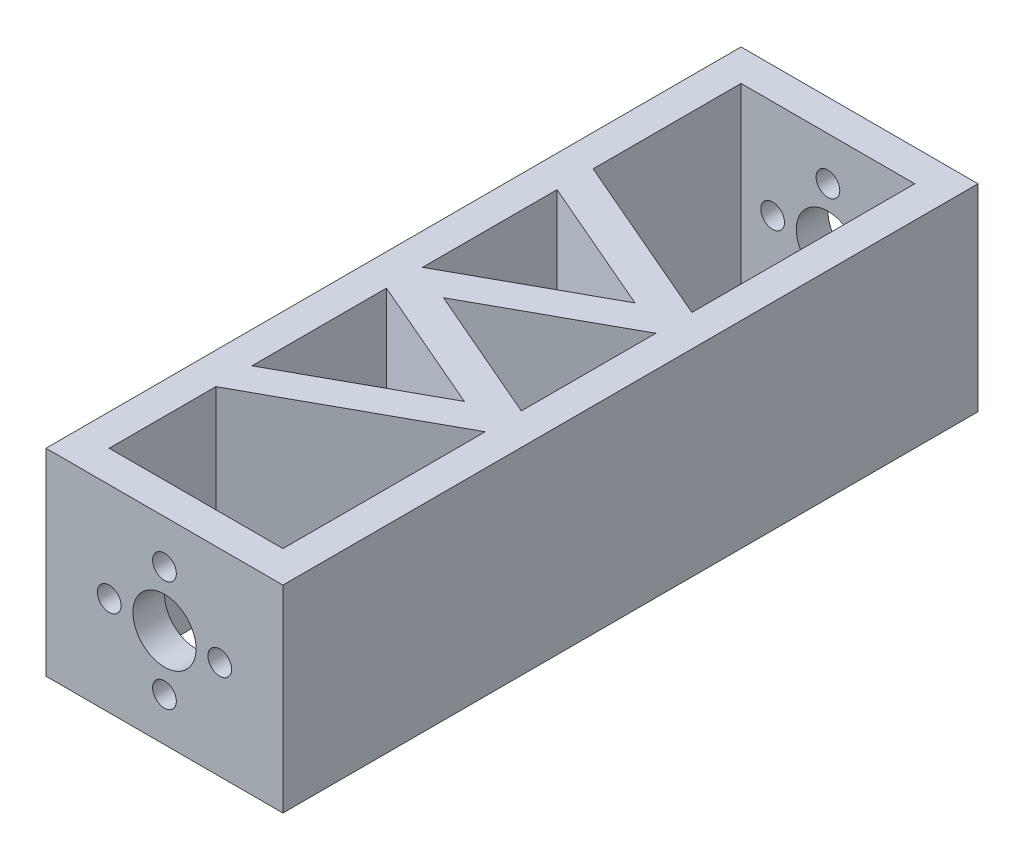
ISO-10303-21;
HEADER;
FILE_DESCRIPTION(('STEP AP214'),'2;1');
FILE_NAME('part.step','',(''),(''),'','','');
FILE_SCHEMA(('AUTOMOTIVE_DESIGN { 1 0 10303 214 1 1 1 1 }'));
ENDSEC;
DATA;
#1=APPLICATION_CONTEXT('core data for automotive mechanical design processes');
#2=APPLICATION_PROTOCOL_DEFINITION('international standard','automotive_design',2000,#1);
#3=PRODUCT_CONTEXT('',#1,'mechanical');
#4=PRODUCT('Part','Part','',(#3));
#5=PRODUCT_RELATED_PRODUCT_CATEGORY('part','',(#4));
#6=PRODUCT_DEFINITION_FORMATION('','',#4);
#7=PRODUCT_DEFINITION_CONTEXT('part definition',#1,'design');
#8=PRODUCT_DEFINITION('design','',#6,#7);
#9=PRODUCT_DEFINITION_SHAPE('','',#8);
#10=(LENGTH_UNIT() NAMED_UNIT(*) SI_UNIT(.MILLI.,.METRE.));
#11=(NAMED_UNIT(*) PLANE_ANGLE_UNIT() SI_UNIT($,.RADIAN.));
#12=(NAMED_UNIT(*) SI_UNIT($,.STERADIAN.) SOLID_ANGLE_UNIT());
#13=UNCERTAINTY_MEASURE_WITH_UNIT(LENGTH_MEASURE(1.E-05),#10,'distance_accuracy_value','');
#14=(GEOMETRIC_REPRESENTATION_CONTEXT(3) GLOBAL_UNCERTAINTY_ASSIGNED_CONTEXT((#13)) GLOBAL_UNIT_ASSIGNED_CONTEXT((#10,
#11,#12)) REPRESENTATION_CONTEXT('',''));
#15=CARTESIAN_POINT('',(0.,0.,0.));
#16=DIRECTION('',(0.,0.,1.));
#17=DIRECTION('',(1.,0.,0.));
#18=AXIS2_PLACEMENT_3D('',#15,#16,#17);
#19=CARTESIAN_POINT('',(-11.,12.5,84.));
#20=DIRECTION('',(-1.,0.,0.));
#21=DIRECTION('',(0.,-1.,0.));
#22=AXIS2_PLACEMENT_3D('',#19,#20,#21);
#23=PLANE('',#22);
#24=DIRECTION('',(0.,-1.,0.));
#25=VECTOR('',#24,1.);
#26=CARTESIAN_POINT('',(-11.,12.5,65.9276597354407));
#27=LINE('',#26,#25);
#28=CARTESIAN_POINT('',(-11.,12.5,65.9276597354407));
#29=VERTEX_POINT('',#28);
#30=CARTESIAN_POINT('',(-11.,-12.5,65.9276597354407));
#31=VERTEX_POINT('',#30);
#32=EDGE_CURVE('E199',#29,#31,#27,.T.);
#33=ORIENTED_EDGE('',*,*,#32,.T.);
#34=DIRECTION('',(0.,0.,-1.));
#35=VECTOR('',#34,1.);
#36=CARTESIAN_POINT('',(-11.,-12.5,84.));
#37=LINE('',#36,#35);
#38=CARTESIAN_POINT('',(-11.,-12.5,48.8944644043383));
#39=VERTEX_POINT('',#38);
#40=EDGE_CURVE('E62',#31,#39,#37,.T.);
#41=ORIENTED_EDGE('',*,*,#40,.T.);
#42=DIRECTION('',(0.,-1.,0.));
#43=VECTOR('',#42,1.);
#44=CARTESIAN_POINT('',(-11.,12.5,48.8944644043383));
#45=LINE('',#44,#43);
#46=CARTESIAN_POINT('',(-11.,12.5,48.8944644043383));
#47=VERTEX_POINT('',#46);
#48=EDGE_CURVE('E192',#47,#39,#45,.T.);
#49=ORIENTED_EDGE('',*,*,#48,.F.);
#50=DIRECTION('',(0.,0.,-1.));
#51=VECTOR('',#50,1.);
#52=CARTESIAN_POINT('',(-11.,12.5,84.));
#53=LINE('',#52,#51);
#54=EDGE_CURVE('E206',#29,#47,#53,.T.);
#55=ORIENTED_EDGE('',*,*,#54,.F.);
#56=EDGE_LOOP('',(#33,#41,#49,#55));
#57=FACE_BOUND('',#56,.T.);
#58=ADVANCED_FACE('F39',(#57),#23,.F.);
#59=DIRECTION('',(0.,-1.,0.));
#60=VECTOR('',#59,1.);
#61=CARTESIAN_POINT('',(-11.,12.5,70.4934339027886));
#62=LINE('',#61,#60);
#63=CARTESIAN_POINT('',(-11.,12.5,70.4934339027886));
#64=VERTEX_POINT('',#63);
#65=CARTESIAN_POINT('',(-11.,-12.5,70.4934339027886));
#66=VERTEX_POINT('',#65);
#67=EDGE_CURVE('E242',#64,#66,#62,.T.);
#68=ORIENTED_EDGE('',*,*,#67,.F.);
#69=CARTESIAN_POINT('',(-11.,12.5,84.));
#70=VERTEX_POINT('',#69);
#71=EDGE_CURVE('E340',#70,#64,#53,.T.);
#72=ORIENTED_EDGE('',*,*,#71,.F.);
#73=DIRECTION('',(0.,1.,0.));
#74=VECTOR('',#73,1.);
#75=CARTESIAN_POINT('',(-11.,12.5,84.));
#76=LINE('',#75,#74);
#77=CARTESIAN_POINT('',(-11.,-12.5,84.));
#78=VERTEX_POINT('',#77);
#79=EDGE_CURVE('E334',#78,#70,#76,.T.);
#80=ORIENTED_EDGE('',*,*,#79,.F.);
#81=EDGE_CURVE('E344',#78,#66,#37,.T.);
#82=ORIENTED_EDGE('',*,*,#81,.T.);
#83=EDGE_LOOP('',(#68,#72,#80,#82));
#84=FACE_BOUND('',#83,.T.);
#85=ADVANCED_FACE('F450',(#84),#23,.F.);
#86=DIRECTION('',(0.,-1.,0.));
#87=VECTOR('',#86,1.);
#88=CARTESIAN_POINT('',(-11.,12.5,22.7297207385401));
#89=LINE('',#88,#87);
#90=CARTESIAN_POINT('',(-11.,12.5,22.7297207385401));
#91=VERTEX_POINT('',#90);
#92=CARTESIAN_POINT('',(-11.,-12.5,22.7297207385401));
#93=VERTEX_POINT('',#92);
#94=EDGE_CURVE('E260',#91,#93,#89,.T.);
#95=ORIENTED_EDGE('',*,*,#94,.T.);
#96=CARTESIAN_POINT('',(-11.,-12.5,4.));
#97=VERTEX_POINT('',#96);
#98=EDGE_CURVE('E343',#93,#97,#37,.T.);
#99=ORIENTED_EDGE('',*,*,#98,.T.);
#100=DIRECTION('',(0.,1.,0.));
#101=VECTOR('',#100,1.);
#102=CARTESIAN_POINT('',(-11.,12.5,4.));
#103=LINE('',#102,#101);
#104=CARTESIAN_POINT('',(-11.,12.5,4.));
#105=VERTEX_POINT('',#104);
#106=EDGE_CURVE('E331',#97,#105,#103,.T.);
#107=ORIENTED_EDGE('',*,*,#106,.T.);
#108=EDGE_CURVE('E337',#91,#105,#53,.T.);
#109=ORIENTED_EDGE('',*,*,#108,.F.);
#110=EDGE_LOOP('',(#95,#99,#107,#109));
#111=FACE_BOUND('',#110,.T.);
#112=ADVANCED_FACE('F425',(#111),#23,.F.);
#113=CARTESIAN_POINT('',(-11.,-12.5,44.3286902369904));
#114=VERTEX_POINT('',#113);
#115=CARTESIAN_POINT('',(-11.,-12.5,27.295494905888));
#116=VERTEX_POINT('',#115);
#117=EDGE_CURVE('E54',#114,#116,#37,.T.);
#118=ORIENTED_EDGE('',*,*,#117,.T.);
#119=DIRECTION('',(0.,-1.,0.));
#120=VECTOR('',#119,1.);
#121=CARTESIAN_POINT('',(-11.,12.5,27.295494905888));
#122=LINE('',#121,#120);
#123=CARTESIAN_POINT('',(-11.,12.5,27.295494905888));
#124=VERTEX_POINT('',#123);
#125=EDGE_CURVE('E263',#124,#116,#122,.T.);
#126=ORIENTED_EDGE('',*,*,#125,.F.);
#127=CARTESIAN_POINT('',(-11.,12.5,44.3286902369904));
#128=VERTEX_POINT('',#127);
#129=EDGE_CURVE('E427',#128,#124,#53,.T.);
#130=ORIENTED_EDGE('',*,*,#129,.F.);
#131=DIRECTION('',(0.,-1.,0.));
#132=VECTOR('',#131,1.);
#133=CARTESIAN_POINT('',(-11.,12.5,44.3286902369904));
#134=LINE('',#133,#132);
#135=EDGE_CURVE('E267',#128,#114,#134,.T.);
#136=ORIENTED_EDGE('',*,*,#135,.T.);
#137=EDGE_LOOP('',(#118,#126,#130,#136));
#138=FACE_BOUND('',#137,.T.);
#139=ADVANCED_FACE('F438',(#138),#23,.F.);
#140=CARTESIAN_POINT('',(11.,12.5,84.));
#141=DIRECTION('',(1.,0.,0.));
#142=DIRECTION('',(0.,1.,0.));
#143=AXIS2_PLACEMENT_3D('',#140,#141,#142);
#144=PLANE('',#143);
#145=DIRECTION('',(0.,-1.,0.));
#146=VECTOR('',#145,1.);
#147=CARTESIAN_POINT('',(11.,12.5,58.3855692746451));
#148=LINE('',#147,#146);
#149=CARTESIAN_POINT('',(11.,12.5,58.3855692746451));
#150=VERTEX_POINT('',#149);
#151=CARTESIAN_POINT('',(11.,-12.5,58.3855692746451));
#152=VERTEX_POINT('',#151);
#153=EDGE_CURVE('E245',#150,#152,#148,.T.);
#154=ORIENTED_EDGE('',*,*,#153,.T.);
#155=DIRECTION('',(0.,0.,-1.));
#156=VECTOR('',#155,1.);
#157=CARTESIAN_POINT('',(11.,-12.5,84.));
#158=LINE('',#157,#156);
#159=CARTESIAN_POINT('',(11.,-12.5,84.));
#160=VERTEX_POINT('',#159);
#161=EDGE_CURVE('E323',#160,#152,#158,.T.);
#162=ORIENTED_EDGE('',*,*,#161,.F.);
#163=DIRECTION('',(0.,-1.,0.));
#164=VECTOR('',#163,1.);
#165=CARTESIAN_POINT('',(11.,12.5,84.));
#166=LINE('',#165,#164);
#167=CARTESIAN_POINT('',(11.,12.5,84.));
#168=VERTEX_POINT('',#167);
#169=EDGE_CURVE('E326',#168,#160,#166,.T.);
#170=ORIENTED_EDGE('',*,*,#169,.F.);
#171=DIRECTION('',(0.,0.,-1.));
#172=VECTOR('',#171,1.);
#173=CARTESIAN_POINT('',(11.,12.5,84.));
#174=LINE('',#173,#172);
#175=EDGE_CURVE('E318',#168,#150,#174,.T.);
#176=ORIENTED_EDGE('',*,*,#175,.T.);
#177=EDGE_LOOP('',(#154,#162,#170,#176));
#178=FACE_BOUND('',#177,.T.);
#179=ADVANCED_FACE('F440',(#178),#144,.F.);
#180=DIRECTION('',(0.,-1.,0.));
#181=VECTOR('',#180,1.);
#182=CARTESIAN_POINT('',(11.,12.5,53.8197951072972));
#183=LINE('',#182,#181);
#184=CARTESIAN_POINT('',(11.,12.5,53.8197951072972));
#185=VERTEX_POINT('',#184);
#186=CARTESIAN_POINT('',(11.,-12.5,53.8197951072972));
#187=VERTEX_POINT('',#186);
#188=EDGE_CURVE('E248',#185,#187,#183,.T.);
#189=ORIENTED_EDGE('',*,*,#188,.F.);
#190=CARTESIAN_POINT('',(11.,12.5,36.7865997761949));
#191=VERTEX_POINT('',#190);
#192=EDGE_CURVE('E322',#185,#191,#174,.T.);
#193=ORIENTED_EDGE('',*,*,#192,.T.);
#194=DIRECTION('',(0.,-1.,0.));
#195=VECTOR('',#194,1.);
#196=CARTESIAN_POINT('',(11.,12.5,36.7865997761949));
#197=LINE('',#196,#195);
#198=CARTESIAN_POINT('',(11.,-12.5,36.7865997761949));
#199=VERTEX_POINT('',#198);
#200=EDGE_CURVE('E254',#191,#199,#197,.T.);
#201=ORIENTED_EDGE('',*,*,#200,.T.);
#202=EDGE_CURVE('E327',#187,#199,#158,.T.);
#203=ORIENTED_EDGE('',*,*,#202,.F.);
#204=EDGE_LOOP('',(#189,#193,#201,#203));
#205=FACE_BOUND('',#204,.T.);
#206=ADVANCED_FACE('F446',(#205),#144,.F.);
#207=DIRECTION('',(0.,-1.,0.));
#208=VECTOR('',#207,1.);
#209=CARTESIAN_POINT('',(11.,12.5,32.220825608847));
#210=LINE('',#209,#208);
#211=CARTESIAN_POINT('',(11.,12.5,32.220825608847));
#212=VERTEX_POINT('',#211);
#213=CARTESIAN_POINT('',(11.,-12.5,32.220825608847));
#214=VERTEX_POINT('',#213);
#215=EDGE_CURVE('E257',#212,#214,#210,.T.);
#216=ORIENTED_EDGE('',*,*,#215,.F.);
#217=CARTESIAN_POINT('',(11.,12.5,4.));
#218=VERTEX_POINT('',#217);
#219=EDGE_CURVE('E313',#212,#218,#174,.T.);
#220=ORIENTED_EDGE('',*,*,#219,.T.);
#221=DIRECTION('',(0.,-1.,0.));
#222=VECTOR('',#221,1.);
#223=CARTESIAN_POINT('',(11.,12.5,4.));
#224=LINE('',#223,#222);
#225=CARTESIAN_POINT('',(11.,-12.5,4.));
#226=VERTEX_POINT('',#225);
#227=EDGE_CURVE('E328',#218,#226,#224,.T.);
#228=ORIENTED_EDGE('',*,*,#227,.T.);
#229=EDGE_CURVE('E321',#214,#226,#158,.T.);
#230=ORIENTED_EDGE('',*,*,#229,.F.);
#231=EDGE_LOOP('',(#216,#220,#228,#230));
#232=FACE_BOUND('',#231,.T.);
#233=ADVANCED_FACE('F449',(#232),#144,.F.);
#234=CARTESIAN_POINT('',(0.,0.,4.));
#235=DIRECTION('',(0.,0.,-1.));
#236=DIRECTION('',(-1.,0.,0.));
#237=AXIS2_PLACEMENT_3D('',#234,#235,#236);
#238=PLANE('',#237);
#239=CARTESIAN_POINT('',(7.,0.,4.));
#240=DIRECTION('',(0.,0.,1.));
#241=DIRECTION('',(1.,0.,0.));
#242=AXIS2_PLACEMENT_3D('',#239,#240,#241);
#243=CIRCLE('',#242,1.5);
#244=CARTESIAN_POINT('',(8.5,0.,4.));
#245=VERTEX_POINT('',#244);
#246=EDGE_CURVE('E371',#245,#245,#243,.T.);
#247=ORIENTED_EDGE('',*,*,#246,.F.);
#248=EDGE_LOOP('',(#247));
#249=FACE_BOUND('',#248,.T.);
#250=CARTESIAN_POINT('',(0.,7.,4.));
#251=DIRECTION('',(0.,0.,1.));
#252=DIRECTION('',(1.,0.,0.));
#253=AXIS2_PLACEMENT_3D('',#250,#251,#252);
#254=CIRCLE('',#253,1.5);
#255=CARTESIAN_POINT('',(1.5,7.,4.));
#256=VERTEX_POINT('',#255);
#257=EDGE_CURVE('E365',#256,#256,#254,.T.);
#258=ORIENTED_EDGE('',*,*,#257,.F.);
#259=EDGE_LOOP('',(#258));
#260=FACE_BOUND('',#259,.T.);
#261=CARTESIAN_POINT('',(-7.,0.,4.));
#262=DIRECTION('',(0.,0.,1.));
#263=DIRECTION('',(1.,0.,0.));
#264=AXIS2_PLACEMENT_3D('',#261,#262,#263);
#265=CIRCLE('',#264,1.5);
#266=CARTESIAN_POINT('',(-5.5,0.,4.));
#267=VERTEX_POINT('',#266);
#268=EDGE_CURVE('E359',#267,#267,#265,.T.);
#269=ORIENTED_EDGE('',*,*,#268,.F.);
#270=EDGE_LOOP('',(#269));
#271=FACE_BOUND('',#270,.T.);
#272=CARTESIAN_POINT('',(0.,-7.,4.));
#273=DIRECTION('',(0.,0.,1.));
#274=DIRECTION('',(1.,0.,0.));
#275=AXIS2_PLACEMENT_3D('',#272,#273,#274);
#276=CIRCLE('',#275,1.5);
#277=CARTESIAN_POINT('',(1.5,-7.,4.));
#278=VERTEX_POINT('',#277);
#279=EDGE_CURVE('E353',#278,#278,#276,.T.);
#280=ORIENTED_EDGE('',*,*,#279,.F.);
#281=EDGE_LOOP('',(#280));
#282=FACE_BOUND('',#281,.T.);
#283=CARTESIAN_POINT('',(0.,0.,4.));
#284=DIRECTION('',(0.,0.,1.));
#285=DIRECTION('',(1.,0.,0.));
#286=AXIS2_PLACEMENT_3D('',#283,#284,#285);
#287=CIRCLE('',#286,4.);
#288=CARTESIAN_POINT('',(4.,0.,4.));
#289=VERTEX_POINT('',#288);
#290=EDGE_CURVE('E347',#289,#289,#287,.T.);
#291=ORIENTED_EDGE('',*,*,#290,.F.);
#292=EDGE_LOOP('',(#291));
#293=FACE_BOUND('',#292,.T.);
#294=ORIENTED_EDGE('',*,*,#227,.F.);
#295=DIRECTION('',(-1.,0.,0.));
#296=VECTOR('',#295,1.);
#297=CARTESIAN_POINT('',(-15.,12.5,4.));
#298=LINE('',#297,#296);
#299=EDGE_CURVE('E377',#218,#105,#298,.T.);
#300=ORIENTED_EDGE('',*,*,#299,.T.);
#301=ORIENTED_EDGE('',*,*,#106,.F.);
#302=DIRECTION('',(1.,0.,0.));
#303=VECTOR('',#302,1.);
#304=CARTESIAN_POINT('',(-15.,-12.5,4.));
#305=LINE('',#304,#303);
#306=EDGE_CURVE('E380',#97,#226,#305,.T.);
#307=ORIENTED_EDGE('',*,*,#306,.T.);
#308=EDGE_LOOP('',(#294,#300,#301,#307));
#309=FACE_BOUND('',#308,.T.);
#310=ADVANCED_FACE('F472',(#249,#260,#271,#282,#293,#309),#238,.F.);
#311=CARTESIAN_POINT('',(0.,0.,0.));
#312=DIRECTION('',(0.,0.,-1.));
#313=DIRECTION('',(-1.,0.,0.));
#314=AXIS2_PLACEMENT_3D('',#311,#312,#313);
#315=PLANE('',#314);
#316=CARTESIAN_POINT('',(0.,-7.,0.));
#317=DIRECTION('',(0.,0.,1.));
#318=DIRECTION('',(1.,0.,0.));
#319=AXIS2_PLACEMENT_3D('',#316,#317,#318);
#320=CIRCLE('',#319,1.5);
#321=CARTESIAN_POINT('',(1.5,-7.,0.));
#322=VERTEX_POINT('',#321);
#323=EDGE_CURVE('E350',#322,#322,#320,.T.);
#324=ORIENTED_EDGE('',*,*,#323,.T.);
#325=EDGE_LOOP('',(#324));
#326=FACE_BOUND('',#325,.T.);
#327=CARTESIAN_POINT('',(0.,7.,0.));
#328=DIRECTION('',(0.,0.,1.));
#329=DIRECTION('',(1.,0.,0.));
#330=AXIS2_PLACEMENT_3D('',#327,#328,#329);
#331=CIRCLE('',#330,1.5);
#332=CARTESIAN_POINT('',(1.5,7.,0.));
#333=VERTEX_POINT('',#332);
#334=EDGE_CURVE('E362',#333,#333,#331,.T.);
#335=ORIENTED_EDGE('',*,*,#334,.T.);
#336=EDGE_LOOP('',(#335));
#337=FACE_BOUND('',#336,.T.);
#338=DIRECTION('',(0.,1.,0.));
#339=VECTOR('',#338,1.);
#340=CARTESIAN_POINT('',(15.,-12.5,0.));
#341=LINE('',#340,#339);
#342=CARTESIAN_POINT('',(15.,-12.5,0.));
#343=VERTEX_POINT('',#342);
#344=CARTESIAN_POINT('',(15.,12.5,0.));
#345=VERTEX_POINT('',#344);
#346=EDGE_CURVE('E374',#343,#345,#341,.T.);
#347=ORIENTED_EDGE('',*,*,#346,.F.);
#348=DIRECTION('',(1.,0.,0.));
#349=VECTOR('',#348,1.);
#350=CARTESIAN_POINT('',(-15.,-12.5,0.));
#351=LINE('',#350,#349);
#352=CARTESIAN_POINT('',(-15.,-12.5,0.));
#353=VERTEX_POINT('',#352);
#354=EDGE_CURVE('E381',#353,#343,#351,.T.);
#355=ORIENTED_EDGE('',*,*,#354,.F.);
#356=DIRECTION('',(0.,-1.,0.));
#357=VECTOR('',#356,1.);
#358=CARTESIAN_POINT('',(-15.,-12.5,0.));
#359=LINE('',#358,#357);
#360=CARTESIAN_POINT('',(-15.,12.5,0.));
#361=VERTEX_POINT('',#360);
#362=EDGE_CURVE('E389',#361,#353,#359,.T.);
#363=ORIENTED_EDGE('',*,*,#362,.F.);
#364=DIRECTION('',(-1.,0.,0.));
#365=VECTOR('',#364,1.);
#366=CARTESIAN_POINT('',(-15.,12.5,0.));
#367=LINE('',#366,#365);
#368=EDGE_CURVE('E387',#345,#361,#367,.T.);
#369=ORIENTED_EDGE('',*,*,#368,.F.);
#370=EDGE_LOOP('',(#347,#355,#363,#369));
#371=FACE_BOUND('',#370,.T.);
#372=CARTESIAN_POINT('',(7.,0.,0.));
#373=DIRECTION('',(0.,0.,1.));
#374=DIRECTION('',(1.,0.,0.));
#375=AXIS2_PLACEMENT_3D('',#372,#373,#374);
#376=CIRCLE('',#375,1.5);
#377=CARTESIAN_POINT('',(8.5,0.,0.));
#378=VERTEX_POINT('',#377);
#379=EDGE_CURVE('E368',#378,#378,#376,.T.);
#380=ORIENTED_EDGE('',*,*,#379,.T.);
#381=EDGE_LOOP('',(#380));
#382=FACE_BOUND('',#381,.T.);
#383=CARTESIAN_POINT('',(-7.,0.,0.));
#384=DIRECTION('',(0.,0.,1.));
#385=DIRECTION('',(1.,0.,0.));
#386=AXIS2_PLACEMENT_3D('',#383,#384,#385);
#387=CIRCLE('',#386,1.5);
#388=CARTESIAN_POINT('',(-5.5,0.,0.));
#389=VERTEX_POINT('',#388);
#390=EDGE_CURVE('E356',#389,#389,#387,.T.);
#391=ORIENTED_EDGE('',*,*,#390,.T.);
#392=EDGE_LOOP('',(#391));
#393=FACE_BOUND('',#392,.T.);
#394=CARTESIAN_POINT('',(0.,0.,0.));
#395=DIRECTION('',(0.,0.,1.));
#396=DIRECTION('',(1.,0.,0.));
#397=AXIS2_PLACEMENT_3D('',#394,#395,#396);
#398=CIRCLE('',#397,4.);
#399=CARTESIAN_POINT('',(4.,0.,0.));
#400=VERTEX_POINT('',#399);
#401=EDGE_CURVE('E346',#400,#400,#398,.T.);
#402=ORIENTED_EDGE('',*,*,#401,.T.);
#403=EDGE_LOOP('',(#402));
#404=FACE_BOUND('',#403,.T.);
#405=ADVANCED_FACE('F406',(#326,#337,#371,#382,#393,#404),#315,.T.);
#406=CARTESIAN_POINT('',(15.,-12.5,4.));
#407=DIRECTION('',(-1.,0.,0.));
#408=DIRECTION('',(0.,0.,1.));
#409=AXIS2_PLACEMENT_3D('',#406,#407,#408);
#410=PLANE('',#409);
#411=ORIENTED_EDGE('',*,*,#346,.T.);
#412=DIRECTION('',(0.,0.,-1.));
#413=VECTOR('',#412,1.);
#414=CARTESIAN_POINT('',(15.,12.5,4.));
#415=LINE('',#414,#413);
#416=CARTESIAN_POINT('',(15.,12.5,88.));
#417=VERTEX_POINT('',#416);
#418=EDGE_CURVE('E11',#417,#345,#415,.T.);
#419=ORIENTED_EDGE('',*,*,#418,.F.);
#420=DIRECTION('',(0.,1.,0.));
#421=VECTOR('',#420,1.);
#422=CARTESIAN_POINT('',(15.,12.5,88.));
#423=LINE('',#422,#421);
#424=CARTESIAN_POINT('',(15.,-12.5,88.));
#425=VERTEX_POINT('',#424);
#426=EDGE_CURVE('E307',#425,#417,#423,.T.);
#427=ORIENTED_EDGE('',*,*,#426,.F.);
#428=DIRECTION('',(0.,0.,-1.));
#429=VECTOR('',#428,1.);
#430=CARTESIAN_POINT('',(15.,-12.5,4.));
#431=LINE('',#430,#429);
#432=EDGE_CURVE('E384',#425,#343,#431,.T.);
#433=ORIENTED_EDGE('',*,*,#432,.T.);
#434=EDGE_LOOP('',(#411,#419,#427,#433));
#435=FACE_BOUND('',#434,.T.);
#436=ADVANCED_FACE('F41',(#435),#410,.F.);
#437=CARTESIAN_POINT('',(-15.,12.5,4.));
#438=DIRECTION('',(0.,-1.,0.));
#439=DIRECTION('',(0.,0.,-1.));
#440=AXIS2_PLACEMENT_3D('',#437,#438,#439);
#441=PLANE('',#440);
#442=ORIENTED_EDGE('',*,*,#129,.T.);
#443=DIRECTION('',(-0.918197417511121,0.,-0.396123090056499));
#444=VECTOR('',#443,1.);
#445=CARTESIAN_POINT('',(-11.6539440517811,12.5,27.0133743797622));
#446=LINE('',#445,#444);
#447=CARTESIAN_POINT('',(6.34945258898297,12.5,34.7802891769996));
#448=VERTEX_POINT('',#447);
#449=EDGE_CURVE('E210',#448,#124,#446,.T.);
#450=ORIENTED_EDGE('',*,*,#449,.F.);
#451=DIRECTION('',(0.876083628622277,0.,-0.482159180831419));
#452=VECTOR('',#451,1.);
#453=CARTESIAN_POINT('',(16.1677080383106,12.5,29.3767388195));
#454=LINE('',#453,#452);
#455=EDGE_CURVE('E207',#128,#448,#454,.T.);
#456=ORIENTED_EDGE('',*,*,#455,.F.);
#457=EDGE_LOOP('',(#442,#450,#456));
#458=FACE_BOUND('',#457,.T.);
#459=ORIENTED_EDGE('',*,*,#54,.T.);
#460=DIRECTION('',(-0.918197417511121,0.,-0.396123090056498));
#461=VECTOR('',#460,1.);
#462=CARTESIAN_POINT('',(-19.5099039220018,12.5,45.2231739243403));
#463=LINE('',#462,#461);
#464=CARTESIAN_POINT('',(6.34945258898295,12.5,56.3792586754498));
#465=VERTEX_POINT('',#464);
#466=EDGE_CURVE('E186',#465,#47,#463,.T.);
#467=ORIENTED_EDGE('',*,*,#466,.F.);
#468=DIRECTION('',(-0.876083628622277,0.,0.482159180831419));
#469=VECTOR('',#468,1.);
#470=CARTESIAN_POINT('',(25.2913668602052,12.5,45.9544344120927));
#471=LINE('',#470,#469);
#472=EDGE_CURVE('E197',#465,#29,#471,.T.);
#473=ORIENTED_EDGE('',*,*,#472,.T.);
#474=EDGE_LOOP('',(#459,#467,#473));
#475=FACE_BOUND('',#474,.T.);
#476=ORIENTED_EDGE('',*,*,#71,.T.);
#477=DIRECTION('',(0.876083628622277,0.,-0.482159180831418));
#478=VECTOR('',#477,1.);
#479=CARTESIAN_POINT('',(27.2200035835309,12.5,49.4587689265818));
#480=LINE('',#479,#478);
#481=EDGE_CURVE('E193',#64,#150,#480,.T.);
#482=ORIENTED_EDGE('',*,*,#481,.T.);
#483=ORIENTED_EDGE('',*,*,#175,.F.);
#484=DIRECTION('',(-1.,0.,0.));
#485=VECTOR('',#484,1.);
#486=CARTESIAN_POINT('',(-15.,12.5,84.));
#487=LINE('',#486,#485);
#488=EDGE_CURVE('E304',#168,#70,#487,.T.);
#489=ORIENTED_EDGE('',*,*,#488,.T.);
#490=EDGE_LOOP('',(#476,#482,#483,#489));
#491=FACE_BOUND('',#490,.T.);
#492=ORIENTED_EDGE('',*,*,#192,.F.);
#493=DIRECTION('',(-0.918197417511121,0.,-0.396123090056498));
#494=VECTOR('',#493,1.);
#495=CARTESIAN_POINT('',(-17.849244202206,12.5,41.373831373105));
#496=LINE('',#495,#494);
#497=CARTESIAN_POINT('',(-6.34945258898296,12.5,46.3350008361857));
#498=VERTEX_POINT('',#497);
#499=EDGE_CURVE('E220',#185,#498,#496,.T.);
#500=ORIENTED_EDGE('',*,*,#499,.T.);
#501=DIRECTION('',(0.876083628622277,0.,-0.482159180831418));
#502=VECTOR('',#501,1.);
#503=CARTESIAN_POINT('',(18.0963447616362,12.5,32.8810733339891));
#504=LINE('',#503,#502);
#505=EDGE_CURVE('E218',#498,#191,#504,.T.);
#506=ORIENTED_EDGE('',*,*,#505,.T.);
#507=EDGE_LOOP('',(#492,#500,#506));
#508=FACE_BOUND('',#507,.T.);
#509=DIRECTION('',(0.,0.,-1.));
#510=VECTOR('',#509,1.);
#511=CARTESIAN_POINT('',(-15.,12.5,4.));
#512=LINE('',#511,#510);
#513=CARTESIAN_POINT('',(-15.,12.5,88.));
#514=VERTEX_POINT('',#513);
#515=EDGE_CURVE('E47',#514,#361,#512,.T.);
#516=ORIENTED_EDGE('',*,*,#515,.F.);
#517=DIRECTION('',(-1.,0.,0.));
#518=VECTOR('',#517,1.);
#519=CARTESIAN_POINT('',(-15.,12.5,88.));
#520=LINE('',#519,#518);
#521=EDGE_CURVE('E310',#417,#514,#520,.T.);
#522=ORIENTED_EDGE('',*,*,#521,.F.);
#523=ORIENTED_EDGE('',*,*,#418,.T.);
#524=ORIENTED_EDGE('',*,*,#368,.T.);
#525=EDGE_LOOP('',(#516,#522,#523,#524));
#526=FACE_BOUND('',#525,.T.);
#527=DIRECTION('',(-0.91819741751112,0.,-0.396123090056499));
#528=VECTOR('',#527,1.);
#529=CARTESIAN_POINT('',(-9.99328433198521,12.5,23.1640318285269));
#530=LINE('',#529,#528);
#531=EDGE_CURVE('E215',#212,#91,#530,.T.);
#532=ORIENTED_EDGE('',*,*,#531,.T.);
#533=ORIENTED_EDGE('',*,*,#108,.T.);
#534=ORIENTED_EDGE('',*,*,#299,.F.);
#535=ORIENTED_EDGE('',*,*,#219,.F.);
#536=EDGE_LOOP('',(#532,#533,#534,#535));
#537=FACE_BOUND('',#536,.T.);
#538=ADVANCED_FACE('F204',(#458,#475,#491,#508,#526,#537),#441,.F.);
#539=CARTESIAN_POINT('',(-15.,-12.5,4.));
#540=DIRECTION('',(1.,0.,0.));
#541=DIRECTION('',(0.,0.,-1.));
#542=AXIS2_PLACEMENT_3D('',#539,#540,#541);
#543=PLANE('',#542);
#544=ORIENTED_EDGE('',*,*,#362,.T.);
#545=DIRECTION('',(0.,0.,-1.));
#546=VECTOR('',#545,1.);
#547=CARTESIAN_POINT('',(-15.,-12.5,4.));
#548=LINE('',#547,#546);
#549=CARTESIAN_POINT('',(-15.,-12.5,88.));
#550=VERTEX_POINT('',#549);
#551=EDGE_CURVE('E394',#550,#353,#548,.T.);
#552=ORIENTED_EDGE('',*,*,#551,.F.);
#553=DIRECTION('',(0.,-1.,0.));
#554=VECTOR('',#553,1.);
#555=CARTESIAN_POINT('',(-15.,12.5,88.));
#556=LINE('',#555,#554);
#557=EDGE_CURVE('E300',#514,#550,#556,.T.);
#558=ORIENTED_EDGE('',*,*,#557,.F.);
#559=ORIENTED_EDGE('',*,*,#515,.T.);
#560=EDGE_LOOP('',(#544,#552,#558,#559));
#561=FACE_BOUND('',#560,.T.);
#562=ADVANCED_FACE('F400',(#561),#543,.F.);
#563=CARTESIAN_POINT('',(-15.,-12.5,4.));
#564=DIRECTION('',(0.,1.,0.));
#565=DIRECTION('',(0.,0.,1.));
#566=AXIS2_PLACEMENT_3D('',#563,#564,#565);
#567=PLANE('',#566);
#568=DIRECTION('',(-0.918197417511121,0.,-0.396123090056499));
#569=VECTOR('',#568,1.);
#570=CARTESIAN_POINT('',(-11.6539440517811,-12.5,27.0133743797622));
#571=LINE('',#570,#569);
#572=CARTESIAN_POINT('',(6.34945258898297,-12.5,34.7802891769996));
#573=VERTEX_POINT('',#572);
#574=EDGE_CURVE('E229',#573,#116,#571,.T.);
#575=ORIENTED_EDGE('',*,*,#574,.T.);
#576=ORIENTED_EDGE('',*,*,#117,.F.);
#577=DIRECTION('',(0.876083628622277,0.,-0.482159180831419));
#578=VECTOR('',#577,1.);
#579=CARTESIAN_POINT('',(16.1677080383106,-12.5,29.3767388195));
#580=LINE('',#579,#578);
#581=EDGE_CURVE('E226',#114,#573,#580,.T.);
#582=ORIENTED_EDGE('',*,*,#581,.T.);
#583=EDGE_LOOP('',(#575,#576,#582));
#584=FACE_BOUND('',#583,.T.);
#585=DIRECTION('',(-0.918197417511121,0.,-0.396123090056498));
#586=VECTOR('',#585,1.);
#587=CARTESIAN_POINT('',(-19.5099039220018,-12.5,45.2231739243403));
#588=LINE('',#587,#586);
#589=CARTESIAN_POINT('',(6.34945258898295,-12.5,56.3792586754498));
#590=VERTEX_POINT('',#589);
#591=EDGE_CURVE('E188',#590,#39,#588,.T.);
#592=ORIENTED_EDGE('',*,*,#591,.T.);
#593=ORIENTED_EDGE('',*,*,#40,.F.);
#594=DIRECTION('',(-0.876083628622277,0.,0.482159180831419));
#595=VECTOR('',#594,1.);
#596=CARTESIAN_POINT('',(25.2913668602052,-12.5,45.9544344120927));
#597=LINE('',#596,#595);
#598=EDGE_CURVE('E223',#590,#31,#597,.T.);
#599=ORIENTED_EDGE('',*,*,#598,.F.);
#600=EDGE_LOOP('',(#592,#593,#599));
#601=FACE_BOUND('',#600,.T.);
#602=DIRECTION('',(0.876083628622277,0.,-0.482159180831418));
#603=VECTOR('',#602,1.);
#604=CARTESIAN_POINT('',(27.2200035835309,-12.5,49.4587689265818));
#605=LINE('',#604,#603);
#606=EDGE_CURVE('E202',#66,#152,#605,.T.);
#607=ORIENTED_EDGE('',*,*,#606,.F.);
#608=ORIENTED_EDGE('',*,*,#81,.F.);
#609=DIRECTION('',(1.,0.,0.));
#610=VECTOR('',#609,1.);
#611=CARTESIAN_POINT('',(-15.,-12.5,84.));
#612=LINE('',#611,#610);
#613=EDGE_CURVE('E299',#78,#160,#612,.T.);
#614=ORIENTED_EDGE('',*,*,#613,.T.);
#615=ORIENTED_EDGE('',*,*,#161,.T.);
#616=EDGE_LOOP('',(#607,#608,#614,#615));
#617=FACE_BOUND('',#616,.T.);
#618=DIRECTION('',(-0.918197417511121,0.,-0.396123090056498));
#619=VECTOR('',#618,1.);
#620=CARTESIAN_POINT('',(-17.849244202206,-12.5,41.373831373105));
#621=LINE('',#620,#619);
#622=CARTESIAN_POINT('',(-6.34945258898296,-12.5,46.3350008361857));
#623=VERTEX_POINT('',#622);
#624=EDGE_CURVE('E237',#187,#623,#621,.T.);
#625=ORIENTED_EDGE('',*,*,#624,.F.);
#626=ORIENTED_EDGE('',*,*,#202,.T.);
#627=DIRECTION('',(0.876083628622277,0.,-0.482159180831418));
#628=VECTOR('',#627,1.);
#629=CARTESIAN_POINT('',(18.0963447616362,-12.5,32.8810733339891));
#630=LINE('',#629,#628);
#631=EDGE_CURVE('E235',#623,#199,#630,.T.);
#632=ORIENTED_EDGE('',*,*,#631,.F.);
#633=EDGE_LOOP('',(#625,#626,#632));
#634=FACE_BOUND('',#633,.T.);
#635=ORIENTED_EDGE('',*,*,#98,.F.);
#636=DIRECTION('',(-0.91819741751112,0.,-0.396123090056499));
#637=VECTOR('',#636,1.);
#638=CARTESIAN_POINT('',(-9.99328433198521,-12.5,23.1640318285269));
#639=LINE('',#638,#637);
#640=EDGE_CURVE('E232',#214,#93,#639,.T.);
#641=ORIENTED_EDGE('',*,*,#640,.F.);
#642=ORIENTED_EDGE('',*,*,#229,.T.);
#643=ORIENTED_EDGE('',*,*,#306,.F.);
#644=EDGE_LOOP('',(#635,#641,#642,#643));
#645=FACE_BOUND('',#644,.T.);
#646=ORIENTED_EDGE('',*,*,#354,.T.);
#647=ORIENTED_EDGE('',*,*,#432,.F.);
#648=DIRECTION('',(1.,0.,0.));
#649=VECTOR('',#648,1.);
#650=CARTESIAN_POINT('',(-15.,-12.5,88.));
#651=LINE('',#650,#649);
#652=EDGE_CURVE('E303',#550,#425,#651,.T.);
#653=ORIENTED_EDGE('',*,*,#652,.F.);
#654=ORIENTED_EDGE('',*,*,#551,.T.);
#655=EDGE_LOOP('',(#646,#647,#653,#654));
#656=FACE_BOUND('',#655,.T.);
#657=ADVANCED_FACE('F409',(#584,#601,#617,#634,#645,#656),#567,.F.);
#658=CARTESIAN_POINT('',(7.,0.,4.));
#659=DIRECTION('',(0.,0.,-1.));
#660=DIRECTION('',(-1.,0.,0.));
#661=AXIS2_PLACEMENT_3D('',#658,#659,#660);
#662=CYLINDRICAL_SURFACE('',#661,1.5);
#663=ORIENTED_EDGE('',*,*,#246,.T.);
#664=EDGE_LOOP('',(#663));
#665=FACE_BOUND('',#664,.T.);
#666=ORIENTED_EDGE('',*,*,#379,.F.);
#667=EDGE_LOOP('',(#666));
#668=FACE_BOUND('',#667,.T.);
#669=ADVANCED_FACE('F460',(#665,#668),#662,.F.);
#670=CARTESIAN_POINT('',(0.,7.,4.));
#671=DIRECTION('',(0.,0.,-1.));
#672=DIRECTION('',(-1.,0.,0.));
#673=AXIS2_PLACEMENT_3D('',#670,#671,#672);
#674=CYLINDRICAL_SURFACE('',#673,1.5);
#675=ORIENTED_EDGE('',*,*,#257,.T.);
#676=EDGE_LOOP('',(#675));
#677=FACE_BOUND('',#676,.T.);
#678=ORIENTED_EDGE('',*,*,#334,.F.);
#679=EDGE_LOOP('',(#678));
#680=FACE_BOUND('',#679,.T.);
#681=ADVANCED_FACE('F571',(#677,#680),#674,.F.);
#682=CARTESIAN_POINT('',(-7.,0.,4.));
#683=DIRECTION('',(0.,0.,-1.));
#684=DIRECTION('',(-1.,0.,0.));
#685=AXIS2_PLACEMENT_3D('',#682,#683,#684);
#686=CYLINDRICAL_SURFACE('',#685,1.5);
#687=ORIENTED_EDGE('',*,*,#268,.T.);
#688=EDGE_LOOP('',(#687));
#689=FACE_BOUND('',#688,.T.);
#690=ORIENTED_EDGE('',*,*,#390,.F.);
#691=EDGE_LOOP('',(#690));
#692=FACE_BOUND('',#691,.T.);
#693=ADVANCED_FACE('F564',(#689,#692),#686,.F.);
#694=CARTESIAN_POINT('',(0.,-7.,4.));
#695=DIRECTION('',(0.,0.,-1.));
#696=DIRECTION('',(-1.,0.,0.));
#697=AXIS2_PLACEMENT_3D('',#694,#695,#696);
#698=CYLINDRICAL_SURFACE('',#697,1.5);
#699=ORIENTED_EDGE('',*,*,#279,.T.);
#700=EDGE_LOOP('',(#699));
#701=FACE_BOUND('',#700,.T.);
#702=ORIENTED_EDGE('',*,*,#323,.F.);
#703=EDGE_LOOP('',(#702));
#704=FACE_BOUND('',#703,.T.);
#705=ADVANCED_FACE('F538',(#701,#704),#698,.F.);
#706=CARTESIAN_POINT('',(0.,0.,4.));
#707=DIRECTION('',(0.,0.,-1.));
#708=DIRECTION('',(-1.,0.,0.));
#709=AXIS2_PLACEMENT_3D('',#706,#707,#708);
#710=CYLINDRICAL_SURFACE('',#709,4.);
#711=ORIENTED_EDGE('',*,*,#290,.T.);
#712=EDGE_LOOP('',(#711));
#713=FACE_BOUND('',#712,.T.);
#714=ORIENTED_EDGE('',*,*,#401,.F.);
#715=EDGE_LOOP('',(#714));
#716=FACE_BOUND('',#715,.T.);
#717=ADVANCED_FACE('F533',(#713,#716),#710,.F.);
#718=CARTESIAN_POINT('',(0.,0.,84.));
#719=DIRECTION('',(0.,0.,1.));
#720=DIRECTION('',(1.,0.,0.));
#721=AXIS2_PLACEMENT_3D('',#718,#719,#720);
#722=PLANE('',#721);
#723=CARTESIAN_POINT('',(-7.,0.,84.));
#724=DIRECTION('',(0.,0.,1.));
#725=DIRECTION('',(1.,0.,0.));
#726=AXIS2_PLACEMENT_3D('',#723,#724,#725);
#727=CIRCLE('',#726,1.5);
#728=CARTESIAN_POINT('',(-5.5,0.,84.));
#729=VERTEX_POINT('',#728);
#730=EDGE_CURVE('E296',#729,#729,#727,.T.);
#731=ORIENTED_EDGE('',*,*,#730,.T.);
#732=EDGE_LOOP('',(#731));
#733=FACE_BOUND('',#732,.T.);
#734=CARTESIAN_POINT('',(0.,7.,84.));
#735=DIRECTION('',(0.,0.,1.));
#736=DIRECTION('',(1.,0.,0.));
#737=AXIS2_PLACEMENT_3D('',#734,#735,#736);
#738=CIRCLE('',#737,1.5);
#739=CARTESIAN_POINT('',(1.5,7.,84.));
#740=VERTEX_POINT('',#739);
#741=EDGE_CURVE('E293',#740,#740,#738,.T.);
#742=ORIENTED_EDGE('',*,*,#741,.T.);
#743=EDGE_LOOP('',(#742));
#744=FACE_BOUND('',#743,.T.);
#745=CARTESIAN_POINT('',(0.,0.,84.));
#746=DIRECTION('',(0.,0.,1.));
#747=DIRECTION('',(1.,0.,0.));
#748=AXIS2_PLACEMENT_3D('',#745,#746,#747);
#749=CIRCLE('',#748,4.);
#750=CARTESIAN_POINT('',(4.,0.,84.));
#751=VERTEX_POINT('',#750);
#752=EDGE_CURVE('E290',#751,#751,#749,.T.);
#753=ORIENTED_EDGE('',*,*,#752,.T.);
#754=EDGE_LOOP('',(#753));
#755=FACE_BOUND('',#754,.T.);
#756=CARTESIAN_POINT('',(7.,0.,84.));
#757=DIRECTION('',(0.,0.,1.));
#758=DIRECTION('',(1.,0.,0.));
#759=AXIS2_PLACEMENT_3D('',#756,#757,#758);
#760=CIRCLE('',#759,1.5);
#761=CARTESIAN_POINT('',(8.5,0.,84.));
#762=VERTEX_POINT('',#761);
#763=EDGE_CURVE('E287',#762,#762,#760,.T.);
#764=ORIENTED_EDGE('',*,*,#763,.T.);
#765=EDGE_LOOP('',(#764));
#766=FACE_BOUND('',#765,.T.);
#767=CARTESIAN_POINT('',(0.,-7.,84.));
#768=DIRECTION('',(0.,0.,1.));
#769=DIRECTION('',(1.,0.,0.));
#770=AXIS2_PLACEMENT_3D('',#767,#768,#769);
#771=CIRCLE('',#770,1.5);
#772=CARTESIAN_POINT('',(1.5,-7.,84.));
#773=VERTEX_POINT('',#772);
#774=EDGE_CURVE('E273',#773,#773,#771,.T.);
#775=ORIENTED_EDGE('',*,*,#774,.T.);
#776=EDGE_LOOP('',(#775));
#777=FACE_BOUND('',#776,.T.);
#778=ORIENTED_EDGE('',*,*,#613,.F.);
#779=ORIENTED_EDGE('',*,*,#79,.T.);
#780=ORIENTED_EDGE('',*,*,#488,.F.);
#781=ORIENTED_EDGE('',*,*,#169,.T.);
#782=EDGE_LOOP('',(#778,#779,#780,#781));
#783=FACE_BOUND('',#782,.T.);
#784=ADVANCED_FACE('F530',(#733,#744,#755,#766,#777,#783),#722,.F.);
#785=CARTESIAN_POINT('',(0.,0.,88.));
#786=DIRECTION('',(0.,0.,1.));
#787=DIRECTION('',(1.,0.,0.));
#788=AXIS2_PLACEMENT_3D('',#785,#786,#787);
#789=PLANE('',#788);
#790=CARTESIAN_POINT('',(-7.,0.,88.));
#791=DIRECTION('',(0.,0.,1.));
#792=DIRECTION('',(1.,0.,0.));
#793=AXIS2_PLACEMENT_3D('',#790,#791,#792);
#794=CIRCLE('',#793,1.5);
#795=CARTESIAN_POINT('',(-5.5,0.,88.));
#796=VERTEX_POINT('',#795);
#797=EDGE_CURVE('E270',#796,#796,#794,.T.);
#798=ORIENTED_EDGE('',*,*,#797,.F.);
#799=EDGE_LOOP('',(#798));
#800=FACE_BOUND('',#799,.T.);
#801=CARTESIAN_POINT('',(0.,7.,88.));
#802=DIRECTION('',(0.,0.,1.));
#803=DIRECTION('',(1.,0.,0.));
#804=AXIS2_PLACEMENT_3D('',#801,#802,#803);
#805=CIRCLE('',#804,1.5);
#806=CARTESIAN_POINT('',(1.5,7.,88.));
#807=VERTEX_POINT('',#806);
#808=EDGE_CURVE('E241',#807,#807,#805,.T.);
#809=ORIENTED_EDGE('',*,*,#808,.F.);
#810=EDGE_LOOP('',(#809));
#811=FACE_BOUND('',#810,.T.);
#812=CARTESIAN_POINT('',(0.,0.,88.));
#813=DIRECTION('',(0.,0.,1.));
#814=DIRECTION('',(1.,0.,0.));
#815=AXIS2_PLACEMENT_3D('',#812,#813,#814);
#816=CIRCLE('',#815,4.);
#817=CARTESIAN_POINT('',(4.,0.,88.));
#818=VERTEX_POINT('',#817);
#819=EDGE_CURVE('E275',#818,#818,#816,.T.);
#820=ORIENTED_EDGE('',*,*,#819,.F.);
#821=EDGE_LOOP('',(#820));
#822=FACE_BOUND('',#821,.T.);
#823=CARTESIAN_POINT('',(7.,0.,88.));
#824=DIRECTION('',(0.,0.,1.));
#825=DIRECTION('',(1.,0.,0.));
#826=AXIS2_PLACEMENT_3D('',#823,#824,#825);
#827=CIRCLE('',#826,1.5);
#828=CARTESIAN_POINT('',(8.5,0.,88.));
#829=VERTEX_POINT('',#828);
#830=EDGE_CURVE('E278',#829,#829,#827,.T.);
#831=ORIENTED_EDGE('',*,*,#830,.F.);
#832=EDGE_LOOP('',(#831));
#833=FACE_BOUND('',#832,.T.);
#834=CARTESIAN_POINT('',(0.,-7.,88.));
#835=DIRECTION('',(0.,0.,1.));
#836=DIRECTION('',(1.,0.,0.));
#837=AXIS2_PLACEMENT_3D('',#834,#835,#836);
#838=CIRCLE('',#837,1.5);
#839=CARTESIAN_POINT('',(1.5,-7.,88.));
#840=VERTEX_POINT('',#839);
#841=EDGE_CURVE('E274',#840,#840,#838,.T.);
#842=ORIENTED_EDGE('',*,*,#841,.F.);
#843=EDGE_LOOP('',(#842));
#844=FACE_BOUND('',#843,.T.);
#845=ORIENTED_EDGE('',*,*,#557,.T.);
#846=ORIENTED_EDGE('',*,*,#652,.T.);
#847=ORIENTED_EDGE('',*,*,#426,.T.);
#848=ORIENTED_EDGE('',*,*,#521,.T.);
#849=EDGE_LOOP('',(#845,#846,#847,#848));
#850=FACE_BOUND('',#849,.T.);
#851=ADVANCED_FACE('F414',(#800,#811,#822,#833,#844,#850),#789,.T.);
#852=CARTESIAN_POINT('',(0.,-7.,77.));
#853=DIRECTION('',(0.,0.,1.));
#854=DIRECTION('',(1.,0.,0.));
#855=AXIS2_PLACEMENT_3D('',#852,#853,#854);
#856=CYLINDRICAL_SURFACE('',#855,1.5);
#857=ORIENTED_EDGE('',*,*,#841,.T.);
#858=EDGE_LOOP('',(#857));
#859=FACE_BOUND('',#858,.T.);
#860=ORIENTED_EDGE('',*,*,#774,.F.);
#861=EDGE_LOOP('',(#860));
#862=FACE_BOUND('',#861,.T.);
#863=ADVANCED_FACE('F521',(#859,#862),#856,.F.);
#864=CARTESIAN_POINT('',(7.,0.,77.));
#865=DIRECTION('',(0.,0.,1.));
#866=DIRECTION('',(1.,0.,0.));
#867=AXIS2_PLACEMENT_3D('',#864,#865,#866);
#868=CYLINDRICAL_SURFACE('',#867,1.5);
#869=ORIENTED_EDGE('',*,*,#830,.T.);
#870=EDGE_LOOP('',(#869));
#871=FACE_BOUND('',#870,.T.);
#872=ORIENTED_EDGE('',*,*,#763,.F.);
#873=EDGE_LOOP('',(#872));
#874=FACE_BOUND('',#873,.T.);
#875=ADVANCED_FACE('F516',(#871,#874),#868,.F.);
#876=CARTESIAN_POINT('',(0.,0.,77.));
#877=DIRECTION('',(0.,0.,1.));
#878=DIRECTION('',(1.,0.,0.));
#879=AXIS2_PLACEMENT_3D('',#876,#877,#878);
#880=CYLINDRICAL_SURFACE('',#879,4.);
#881=ORIENTED_EDGE('',*,*,#819,.T.);
#882=EDGE_LOOP('',(#881));
#883=FACE_BOUND('',#882,.T.);
#884=ORIENTED_EDGE('',*,*,#752,.F.);
#885=EDGE_LOOP('',(#884));
#886=FACE_BOUND('',#885,.T.);
#887=ADVANCED_FACE('F513',(#883,#886),#880,.F.);
#888=CARTESIAN_POINT('',(0.,7.,77.));
#889=DIRECTION('',(0.,0.,1.));
#890=DIRECTION('',(1.,0.,0.));
#891=AXIS2_PLACEMENT_3D('',#888,#889,#890);
#892=CYLINDRICAL_SURFACE('',#891,1.5);
#893=ORIENTED_EDGE('',*,*,#808,.T.);
#894=EDGE_LOOP('',(#893));
#895=FACE_BOUND('',#894,.T.);
#896=ORIENTED_EDGE('',*,*,#741,.F.);
#897=EDGE_LOOP('',(#896));
#898=FACE_BOUND('',#897,.T.);
#899=ADVANCED_FACE('F511',(#895,#898),#892,.F.);
#900=CARTESIAN_POINT('',(-7.,0.,77.));
#901=DIRECTION('',(0.,0.,1.));
#902=DIRECTION('',(1.,0.,0.));
#903=AXIS2_PLACEMENT_3D('',#900,#901,#902);
#904=CYLINDRICAL_SURFACE('',#903,1.5);
#905=ORIENTED_EDGE('',*,*,#797,.T.);
#906=EDGE_LOOP('',(#905));
#907=FACE_BOUND('',#906,.T.);
#908=ORIENTED_EDGE('',*,*,#730,.F.);
#909=EDGE_LOOP('',(#908));
#910=FACE_BOUND('',#909,.T.);
#911=ADVANCED_FACE('F508',(#907,#910),#904,.F.);
#912=CARTESIAN_POINT('',(25.2913668602052,12.5,45.9544344120927));
#913=DIRECTION('',(0.482159180831419,0.,0.876083628622277));
#914=DIRECTION('',(0.876083628622277,0.,-0.482159180831419));
#915=AXIS2_PLACEMENT_3D('',#912,#913,#914);
#916=PLANE('',#915);
#917=ORIENTED_EDGE('',*,*,#598,.T.);
#918=ORIENTED_EDGE('',*,*,#32,.F.);
#919=ORIENTED_EDGE('',*,*,#472,.F.);
#920=DIRECTION('',(0.,-1.,0.));
#921=VECTOR('',#920,1.);
#922=CARTESIAN_POINT('',(6.34945258898295,12.5,56.3792586754498));
#923=LINE('',#922,#921);
#924=EDGE_CURVE('E182',#465,#590,#923,.T.);
#925=ORIENTED_EDGE('',*,*,#924,.T.);
#926=EDGE_LOOP('',(#917,#918,#919,#925));
#927=FACE_BOUND('',#926,.T.);
#928=ADVANCED_FACE('F198',(#927),#916,.F.);
#929=CARTESIAN_POINT('',(27.2200035835309,12.5,49.4587689265818));
#930=DIRECTION('',(-0.482159180831418,0.,-0.876083628622277));
#931=DIRECTION('',(-0.876083628622277,0.,0.482159180831418));
#932=AXIS2_PLACEMENT_3D('',#929,#930,#931);
#933=PLANE('',#932);
#934=ORIENTED_EDGE('',*,*,#606,.T.);
#935=ORIENTED_EDGE('',*,*,#153,.F.);
#936=ORIENTED_EDGE('',*,*,#481,.F.);
#937=ORIENTED_EDGE('',*,*,#67,.T.);
#938=EDGE_LOOP('',(#934,#935,#936,#937));
#939=FACE_BOUND('',#938,.T.);
#940=ADVANCED_FACE('F488',(#939),#933,.F.);
#941=CARTESIAN_POINT('',(-17.849244202206,12.5,41.373831373105));
#942=DIRECTION('',(-0.396123090056499,0.,0.918197417511121));
#943=DIRECTION('',(0.918197417511121,0.,0.396123090056499));
#944=AXIS2_PLACEMENT_3D('',#941,#942,#943);
#945=PLANE('',#944);
#946=ORIENTED_EDGE('',*,*,#624,.T.);
#947=DIRECTION('',(0.,-1.,0.));
#948=VECTOR('',#947,1.);
#949=CARTESIAN_POINT('',(-6.34945258898296,12.5,46.3350008361857));
#950=LINE('',#949,#948);
#951=EDGE_CURVE('E251',#498,#623,#950,.T.);
#952=ORIENTED_EDGE('',*,*,#951,.F.);
#953=ORIENTED_EDGE('',*,*,#499,.F.);
#954=ORIENTED_EDGE('',*,*,#188,.T.);
#955=EDGE_LOOP('',(#946,#952,#953,#954));
#956=FACE_BOUND('',#955,.T.);
#957=ADVANCED_FACE('F486',(#956),#945,.F.);
#958=CARTESIAN_POINT('',(18.0963447616362,12.5,32.8810733339891));
#959=DIRECTION('',(-0.482159180831418,0.,-0.876083628622277));
#960=DIRECTION('',(-0.876083628622277,0.,0.482159180831418));
#961=AXIS2_PLACEMENT_3D('',#958,#959,#960);
#962=PLANE('',#961);
#963=ORIENTED_EDGE('',*,*,#631,.T.);
#964=ORIENTED_EDGE('',*,*,#200,.F.);
#965=ORIENTED_EDGE('',*,*,#505,.F.);
#966=ORIENTED_EDGE('',*,*,#951,.T.);
#967=EDGE_LOOP('',(#963,#964,#965,#966));
#968=FACE_BOUND('',#967,.T.);
#969=ADVANCED_FACE('F484',(#968),#962,.F.);
#970=CARTESIAN_POINT('',(-9.99328433198521,12.5,23.1640318285269));
#971=DIRECTION('',(-0.396123090056499,0.,0.918197417511121));
#972=DIRECTION('',(0.918197417511121,0.,0.396123090056499));
#973=AXIS2_PLACEMENT_3D('',#970,#971,#972);
#974=PLANE('',#973);
#975=ORIENTED_EDGE('',*,*,#640,.T.);
#976=ORIENTED_EDGE('',*,*,#94,.F.);
#977=ORIENTED_EDGE('',*,*,#531,.F.);
#978=ORIENTED_EDGE('',*,*,#215,.T.);
#979=EDGE_LOOP('',(#975,#976,#977,#978));
#980=FACE_BOUND('',#979,.T.);
#981=ADVANCED_FACE('F423',(#980),#974,.F.);
#982=CARTESIAN_POINT('',(-11.6539440517811,12.5,27.0133743797622));
#983=DIRECTION('',(-0.396123090056499,0.,0.91819741751112));
#984=DIRECTION('',(0.918197417511121,0.,0.396123090056499));
#985=AXIS2_PLACEMENT_3D('',#982,#983,#984);
#986=PLANE('',#985);
#987=ORIENTED_EDGE('',*,*,#574,.F.);
#988=DIRECTION('',(0.,-1.,0.));
#989=VECTOR('',#988,1.);
#990=CARTESIAN_POINT('',(6.34945258898297,12.5,34.7802891769996));
#991=LINE('',#990,#989);
#992=EDGE_CURVE('E265',#448,#573,#991,.T.);
#993=ORIENTED_EDGE('',*,*,#992,.F.);
#994=ORIENTED_EDGE('',*,*,#449,.T.);
#995=ORIENTED_EDGE('',*,*,#125,.T.);
#996=EDGE_LOOP('',(#987,#993,#994,#995));
#997=FACE_BOUND('',#996,.T.);
#998=ADVANCED_FACE('F434',(#997),#986,.T.);
#999=CARTESIAN_POINT('',(16.1677080383106,12.5,29.3767388195));
#1000=DIRECTION('',(-0.482159180831418,0.,-0.876083628622277));
#1001=DIRECTION('',(-0.876083628622277,0.,0.482159180831419));
#1002=AXIS2_PLACEMENT_3D('',#999,#1000,#1001);
#1003=PLANE('',#1002);
#1004=ORIENTED_EDGE('',*,*,#581,.F.);
#1005=ORIENTED_EDGE('',*,*,#135,.F.);
#1006=ORIENTED_EDGE('',*,*,#455,.T.);
#1007=ORIENTED_EDGE('',*,*,#992,.T.);
#1008=EDGE_LOOP('',(#1004,#1005,#1006,#1007));
#1009=FACE_BOUND('',#1008,.T.);
#1010=ADVANCED_FACE('F437',(#1009),#1003,.T.);
#1011=CARTESIAN_POINT('',(-19.5099039220018,12.5,45.2231739243403));
#1012=DIRECTION('',(-0.396123090056499,0.,0.918197417511121));
#1013=DIRECTION('',(0.918197417511121,0.,0.396123090056499));
#1014=AXIS2_PLACEMENT_3D('',#1011,#1012,#1013);
#1015=PLANE('',#1014);
#1016=ORIENTED_EDGE('',*,*,#591,.F.);
#1017=ORIENTED_EDGE('',*,*,#924,.F.);
#1018=ORIENTED_EDGE('',*,*,#466,.T.);
#1019=ORIENTED_EDGE('',*,*,#48,.T.);
#1020=EDGE_LOOP('',(#1016,#1017,#1018,#1019));
#1021=FACE_BOUND('',#1020,.T.);
#1022=ADVANCED_FACE('F184',(#1021),#1015,.T.);
#1023=CLOSED_SHELL('',(#58,#85,#112,#139,#179,#206,#233,#310,#405,#436,#538,#562,#657,#669,#681,
#693,#705,#717,#784,#851,#863,#875,#887,#899,#911,#928,#940,#957,#969,#981,#998,#1010,#1022));
#1024=MANIFOLD_SOLID_BREP('B2',#1023);
#1025=ADVANCED_BREP_SHAPE_REPRESENTATION('',(#18,#1024),#14);
#1026=SHAPE_DEFINITION_REPRESENTATION(#9,#1025);
ENDSEC;
END-ISO-10303-21;
